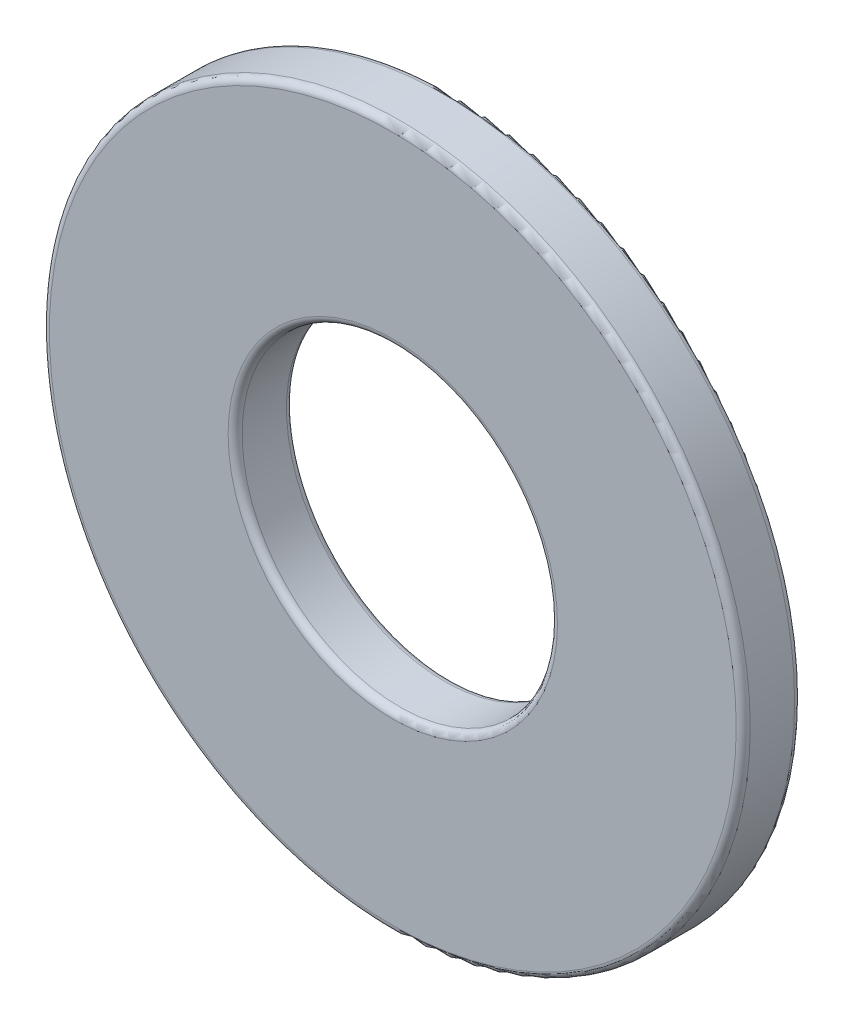
ISO-10303-21;
HEADER;
FILE_DESCRIPTION(('STEP AP214'),'2;1');
FILE_NAME('part.step','',(''),(''),'','','');
FILE_SCHEMA(('AUTOMOTIVE_DESIGN { 1 0 10303 214 1 1 1 1 }'));
ENDSEC;
DATA;
#1=APPLICATION_CONTEXT('core data for automotive mechanical design processes');
#2=APPLICATION_PROTOCOL_DEFINITION('international standard','automotive_design',2000,#1);
#3=PRODUCT_CONTEXT('',#1,'mechanical');
#4=PRODUCT('Part','Part','',(#3));
#5=PRODUCT_RELATED_PRODUCT_CATEGORY('part','',(#4));
#6=PRODUCT_DEFINITION_FORMATION('','',#4);
#7=PRODUCT_DEFINITION_CONTEXT('part definition',#1,'design');
#8=PRODUCT_DEFINITION('design','',#6,#7);
#9=PRODUCT_DEFINITION_SHAPE('','',#8);
#10=(LENGTH_UNIT() NAMED_UNIT(*) SI_UNIT(.MILLI.,.METRE.));
#11=(NAMED_UNIT(*) PLANE_ANGLE_UNIT() SI_UNIT($,.RADIAN.));
#12=(NAMED_UNIT(*) SI_UNIT($,.STERADIAN.) SOLID_ANGLE_UNIT());
#13=UNCERTAINTY_MEASURE_WITH_UNIT(LENGTH_MEASURE(1.E-05),#10,'distance_accuracy_value','');
#14=(GEOMETRIC_REPRESENTATION_CONTEXT(3) GLOBAL_UNCERTAINTY_ASSIGNED_CONTEXT((#13)) GLOBAL_UNIT_ASSIGNED_CONTEXT((#10,
#11,#12)) REPRESENTATION_CONTEXT('',''));
#15=CARTESIAN_POINT('',(0.,0.,0.));
#16=DIRECTION('',(0.,0.,1.));
#17=DIRECTION('',(1.,0.,0.));
#18=AXIS2_PLACEMENT_3D('',#15,#16,#17);
#19=CARTESIAN_POINT('',(0.,0.,-0.25));
#20=DIRECTION('',(0.,0.,1.));
#21=DIRECTION('',(1.,0.,0.));
#22=AXIS2_PLACEMENT_3D('',#19,#20,#21);
#23=CYLINDRICAL_SURFACE('',#22,3.);
#24=CARTESIAN_POINT('',(0.,0.,0.19));
#25=DIRECTION('',(0.,0.,1.));
#26=DIRECTION('',(1.,0.,0.));
#27=AXIS2_PLACEMENT_3D('',#24,#25,#26);
#28=CIRCLE('',#27,3.);
#29=CARTESIAN_POINT('',(3.,0.,0.19));
#30=VERTEX_POINT('',#29);
#31=EDGE_CURVE('E64',#30,#30,#28,.F.);
#32=ORIENTED_EDGE('',*,*,#31,.T.);
#33=EDGE_LOOP('',(#32));
#34=FACE_BOUND('',#33,.T.);
#35=CARTESIAN_POINT('',(0.,0.,-0.19));
#36=DIRECTION('',(0.,0.,1.));
#37=DIRECTION('',(1.,0.,0.));
#38=AXIS2_PLACEMENT_3D('',#35,#36,#37);
#39=CIRCLE('',#38,3.);
#40=CARTESIAN_POINT('',(3.,0.,-0.19));
#41=VERTEX_POINT('',#40);
#42=EDGE_CURVE('E68',#41,#41,#39,.T.);
#43=ORIENTED_EDGE('',*,*,#42,.T.);
#44=EDGE_LOOP('',(#43));
#45=FACE_BOUND('',#44,.T.);
#46=ADVANCED_FACE('F38',(#34,#45),#23,.T.);
#47=CARTESIAN_POINT('',(0.,0.,-0.25));
#48=DIRECTION('',(0.,0.,1.));
#49=DIRECTION('',(1.,0.,0.));
#50=AXIS2_PLACEMENT_3D('',#47,#48,#49);
#51=PLANE('',#50);
#52=CARTESIAN_POINT('',(0.,0.,-0.25));
#53=DIRECTION('',(0.,0.,1.));
#54=DIRECTION('',(1.,0.,0.));
#55=AXIS2_PLACEMENT_3D('',#52,#53,#54);
#56=CIRCLE('',#55,2.94);
#57=CARTESIAN_POINT('',(2.94,0.,-0.25));
#58=VERTEX_POINT('',#57);
#59=EDGE_CURVE('E52',#58,#58,#56,.F.);
#60=ORIENTED_EDGE('',*,*,#59,.T.);
#61=EDGE_LOOP('',(#60));
#62=FACE_BOUND('',#61,.T.);
#63=CARTESIAN_POINT('',(0.,0.,-0.25));
#64=DIRECTION('',(0.,0.,1.));
#65=DIRECTION('',(1.,0.,0.));
#66=AXIS2_PLACEMENT_3D('',#63,#64,#65);
#67=CIRCLE('',#66,1.41);
#68=CARTESIAN_POINT('',(1.41,0.,-0.25));
#69=VERTEX_POINT('',#68);
#70=EDGE_CURVE('E58',#69,#69,#67,.T.);
#71=ORIENTED_EDGE('',*,*,#70,.T.);
#72=EDGE_LOOP('',(#71));
#73=FACE_BOUND('',#72,.T.);
#74=ADVANCED_FACE('F97',(#62,#73),#51,.F.);
#75=CARTESIAN_POINT('',(0.,0.,0.25));
#76=DIRECTION('',(0.,0.,1.));
#77=DIRECTION('',(1.,0.,0.));
#78=AXIS2_PLACEMENT_3D('',#75,#76,#77);
#79=PLANE('',#78);
#80=CARTESIAN_POINT('',(0.,0.,0.25));
#81=DIRECTION('',(0.,0.,1.));
#82=DIRECTION('',(1.,0.,0.));
#83=AXIS2_PLACEMENT_3D('',#80,#81,#82);
#84=CIRCLE('',#83,2.94);
#85=CARTESIAN_POINT('',(2.94,0.,0.25));
#86=VERTEX_POINT('',#85);
#87=EDGE_CURVE('E72',#86,#86,#84,.T.);
#88=ORIENTED_EDGE('',*,*,#87,.T.);
#89=EDGE_LOOP('',(#88));
#90=FACE_BOUND('',#89,.T.);
#91=CARTESIAN_POINT('',(0.,0.,0.25));
#92=DIRECTION('',(0.,0.,1.));
#93=DIRECTION('',(1.,0.,0.));
#94=AXIS2_PLACEMENT_3D('',#91,#92,#93);
#95=CIRCLE('',#94,1.41);
#96=CARTESIAN_POINT('',(1.41,0.,0.25));
#97=VERTEX_POINT('',#96);
#98=EDGE_CURVE('E76',#97,#97,#95,.F.);
#99=ORIENTED_EDGE('',*,*,#98,.T.);
#100=EDGE_LOOP('',(#99));
#101=FACE_BOUND('',#100,.T.);
#102=ADVANCED_FACE('F82',(#90,#101),#79,.T.);
#103=CARTESIAN_POINT('',(0.,0.,-0.25));
#104=DIRECTION('',(0.,0.,1.));
#105=DIRECTION('',(1.,0.,0.));
#106=AXIS2_PLACEMENT_3D('',#103,#104,#105);
#107=CYLINDRICAL_SURFACE('',#106,1.35);
#108=CARTESIAN_POINT('',(0.,0.,0.19));
#109=DIRECTION('',(0.,0.,1.));
#110=DIRECTION('',(1.,0.,0.));
#111=AXIS2_PLACEMENT_3D('',#108,#109,#110);
#112=CIRCLE('',#111,1.35);
#113=CARTESIAN_POINT('',(1.35,0.,0.19));
#114=VERTEX_POINT('',#113);
#115=EDGE_CURVE('E10',#114,#114,#112,.T.);
#116=ORIENTED_EDGE('',*,*,#115,.T.);
#117=EDGE_LOOP('',(#116));
#118=FACE_BOUND('',#117,.T.);
#119=CARTESIAN_POINT('',(0.,0.,-0.19));
#120=DIRECTION('',(0.,0.,1.));
#121=DIRECTION('',(1.,0.,0.));
#122=AXIS2_PLACEMENT_3D('',#119,#120,#121);
#123=CIRCLE('',#122,1.35);
#124=CARTESIAN_POINT('',(1.35,0.,-0.19));
#125=VERTEX_POINT('',#124);
#126=EDGE_CURVE('E46',#125,#125,#123,.F.);
#127=ORIENTED_EDGE('',*,*,#126,.T.);
#128=EDGE_LOOP('',(#127));
#129=FACE_BOUND('',#128,.T.);
#130=ADVANCED_FACE('F109',(#118,#129),#107,.F.);
#131=CARTESIAN_POINT('',(0.,0.,0.19));
#132=DIRECTION('',(0.,0.,1.));
#133=DIRECTION('',(1.,0.,0.));
#134=AXIS2_PLACEMENT_3D('',#131,#132,#133);
#135=TOROIDAL_SURFACE('',#134,2.94,0.06);
#136=ORIENTED_EDGE('',*,*,#31,.F.);
#137=EDGE_LOOP('',(#136));
#138=FACE_BOUND('',#137,.T.);
#139=ORIENTED_EDGE('',*,*,#87,.F.);
#140=EDGE_LOOP('',(#139));
#141=FACE_BOUND('',#140,.T.);
#142=ADVANCED_FACE('F93',(#138,#141),#135,.T.);
#143=CARTESIAN_POINT('',(0.,0.,-0.19));
#144=DIRECTION('',(0.,0.,1.));
#145=DIRECTION('',(1.,0.,0.));
#146=AXIS2_PLACEMENT_3D('',#143,#144,#145);
#147=TOROIDAL_SURFACE('',#146,2.94,0.06);
#148=ORIENTED_EDGE('',*,*,#59,.F.);
#149=EDGE_LOOP('',(#148));
#150=FACE_BOUND('',#149,.T.);
#151=ORIENTED_EDGE('',*,*,#42,.F.);
#152=EDGE_LOOP('',(#151));
#153=FACE_BOUND('',#152,.T.);
#154=ADVANCED_FACE('F87',(#150,#153),#147,.T.);
#155=CARTESIAN_POINT('',(0.,0.,0.19));
#156=DIRECTION('',(0.,0.,1.));
#157=DIRECTION('',(1.,0.,0.));
#158=AXIS2_PLACEMENT_3D('',#155,#156,#157);
#159=TOROIDAL_SURFACE('',#158,1.41,0.06);
#160=ORIENTED_EDGE('',*,*,#98,.F.);
#161=EDGE_LOOP('',(#160));
#162=FACE_BOUND('',#161,.T.);
#163=ORIENTED_EDGE('',*,*,#115,.F.);
#164=EDGE_LOOP('',(#163));
#165=FACE_BOUND('',#164,.T.);
#166=ADVANCED_FACE('F84',(#162,#165),#159,.T.);
#167=CARTESIAN_POINT('',(0.,0.,-0.19));
#168=DIRECTION('',(0.,0.,1.));
#169=DIRECTION('',(1.,0.,0.));
#170=AXIS2_PLACEMENT_3D('',#167,#168,#169);
#171=TOROIDAL_SURFACE('',#170,1.41,0.06);
#172=ORIENTED_EDGE('',*,*,#126,.F.);
#173=EDGE_LOOP('',(#172));
#174=FACE_BOUND('',#173,.T.);
#175=ORIENTED_EDGE('',*,*,#70,.F.);
#176=EDGE_LOOP('',(#175));
#177=FACE_BOUND('',#176,.T.);
#178=ADVANCED_FACE('F40',(#174,#177),#171,.T.);
#179=CLOSED_SHELL('',(#46,#74,#102,#130,#142,#154,#166,#178));
#180=MANIFOLD_SOLID_BREP('B2',#179);
#181=ADVANCED_BREP_SHAPE_REPRESENTATION('',(#18,#180),#14);
#182=SHAPE_DEFINITION_REPRESENTATION(#9,#181);
ENDSEC;
END-ISO-10303-21;
